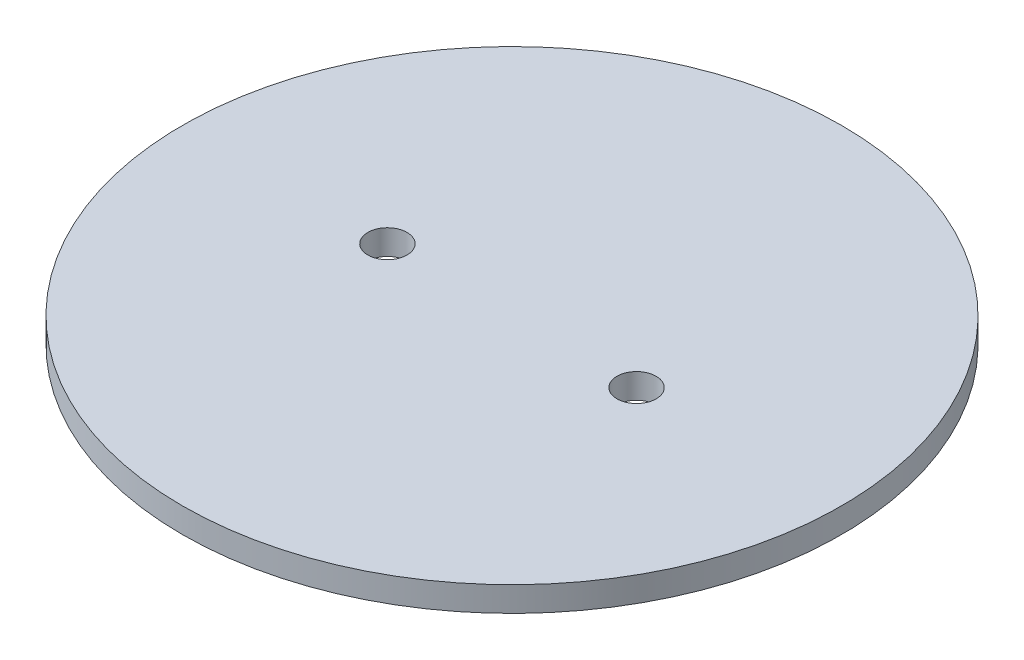
ISO-10303-21;
HEADER;
FILE_DESCRIPTION(('STEP AP214'),'2;1');
FILE_NAME('part.step','',(''),(''),'','','');
FILE_SCHEMA(('AUTOMOTIVE_DESIGN { 1 0 10303 214 1 1 1 1 }'));
ENDSEC;
DATA;
#1=APPLICATION_CONTEXT('core data for automotive mechanical design processes');
#2=APPLICATION_PROTOCOL_DEFINITION('international standard','automotive_design',2000,#1);
#3=PRODUCT_CONTEXT('',#1,'mechanical');
#4=PRODUCT('Part','Part','',(#3));
#5=PRODUCT_RELATED_PRODUCT_CATEGORY('part','',(#4));
#6=PRODUCT_DEFINITION_FORMATION('','',#4);
#7=PRODUCT_DEFINITION_CONTEXT('part definition',#1,'design');
#8=PRODUCT_DEFINITION('design','',#6,#7);
#9=PRODUCT_DEFINITION_SHAPE('','',#8);
#10=(LENGTH_UNIT() NAMED_UNIT(*) SI_UNIT(.MILLI.,.METRE.));
#11=(NAMED_UNIT(*) PLANE_ANGLE_UNIT() SI_UNIT($,.RADIAN.));
#12=(NAMED_UNIT(*) SI_UNIT($,.STERADIAN.) SOLID_ANGLE_UNIT());
#13=UNCERTAINTY_MEASURE_WITH_UNIT(LENGTH_MEASURE(1.E-05),#10,'distance_accuracy_value','');
#14=(GEOMETRIC_REPRESENTATION_CONTEXT(3) GLOBAL_UNCERTAINTY_ASSIGNED_CONTEXT((#13)) GLOBAL_UNIT_ASSIGNED_CONTEXT((#10,
#11,#12)) REPRESENTATION_CONTEXT('',''));
#15=CARTESIAN_POINT('',(0.,0.,0.));
#16=DIRECTION('',(0.,0.,1.));
#17=DIRECTION('',(1.,0.,0.));
#18=AXIS2_PLACEMENT_3D('',#15,#16,#17);
#19=CARTESIAN_POINT('',(33.6636824416529,2.54,33.6537385774837));
#20=DIRECTION('',(0.,1.,0.));
#21=DIRECTION('',(0.,0.,1.));
#22=AXIS2_PLACEMENT_3D('',#19,#20,#21);
#23=PLANE('',#22);
#24=CARTESIAN_POINT('',(46.373685990665,2.54,33.6537385774837));
#25=DIRECTION('',(0.,1.,0.));
#26=DIRECTION('',(0.,0.,-1.));
#27=AXIS2_PLACEMENT_3D('',#24,#25,#26);
#28=CIRCLE('',#27,2.);
#29=CARTESIAN_POINT('',(46.373685990665,2.54,31.6537385774837));
#30=VERTEX_POINT('',#29);
#31=EDGE_CURVE('E52',#30,#30,#28,.T.);
#32=ORIENTED_EDGE('',*,*,#31,.F.);
#33=EDGE_LOOP('',(#32));
#34=FACE_BOUND('',#33,.T.);
#35=CARTESIAN_POINT('',(33.6636824416529,2.54,33.6537385774837));
#36=DIRECTION('',(0.,1.,0.));
#37=DIRECTION('',(0.,0.,1.));
#38=AXIS2_PLACEMENT_3D('',#35,#36,#37);
#39=CIRCLE('',#38,33.6254391642506);
#40=CARTESIAN_POINT('',(33.6636824416529,2.54,67.2791777417343));
#41=VERTEX_POINT('',#40);
#42=EDGE_CURVE('E10',#41,#41,#39,.T.);
#43=ORIENTED_EDGE('',*,*,#42,.T.);
#44=EDGE_LOOP('',(#43));
#45=FACE_BOUND('',#44,.T.);
#46=CARTESIAN_POINT('',(20.9536788926407,2.54,33.6537385774837));
#47=DIRECTION('',(0.,1.,0.));
#48=DIRECTION('',(0.,0.,1.));
#49=AXIS2_PLACEMENT_3D('',#46,#47,#48);
#50=CIRCLE('',#49,2.);
#51=CARTESIAN_POINT('',(20.9536788926407,2.54,35.6537385774837));
#52=VERTEX_POINT('',#51);
#53=EDGE_CURVE('E57',#52,#52,#50,.T.);
#54=ORIENTED_EDGE('',*,*,#53,.F.);
#55=EDGE_LOOP('',(#54));
#56=FACE_BOUND('',#55,.T.);
#57=ADVANCED_FACE('F41',(#34,#45,#56),#23,.T.);
#58=CARTESIAN_POINT('',(33.6636824416529,0.,33.6537385774837));
#59=DIRECTION('',(0.,1.,0.));
#60=DIRECTION('',(0.,0.,1.));
#61=AXIS2_PLACEMENT_3D('',#58,#59,#60);
#62=PLANE('',#61);
#63=CARTESIAN_POINT('',(33.6636824416529,0.,33.6537385774837));
#64=DIRECTION('',(0.,1.,0.));
#65=DIRECTION('',(0.,0.,1.));
#66=AXIS2_PLACEMENT_3D('',#63,#64,#65);
#67=CIRCLE('',#66,33.6254391642506);
#68=CARTESIAN_POINT('',(33.6636824416529,0.,67.2791777417343));
#69=VERTEX_POINT('',#68);
#70=EDGE_CURVE('E45',#69,#69,#67,.T.);
#71=ORIENTED_EDGE('',*,*,#70,.F.);
#72=EDGE_LOOP('',(#71));
#73=FACE_BOUND('',#72,.T.);
#74=CARTESIAN_POINT('',(46.373685990665,0.,33.6537385774837));
#75=DIRECTION('',(0.,1.,0.));
#76=DIRECTION('',(0.,0.,-1.));
#77=AXIS2_PLACEMENT_3D('',#74,#75,#76);
#78=CIRCLE('',#77,2.);
#79=CARTESIAN_POINT('',(46.373685990665,0.,31.6537385774837));
#80=VERTEX_POINT('',#79);
#81=EDGE_CURVE('E54',#80,#80,#78,.T.);
#82=ORIENTED_EDGE('',*,*,#81,.T.);
#83=EDGE_LOOP('',(#82));
#84=FACE_BOUND('',#83,.T.);
#85=CARTESIAN_POINT('',(20.9536788926407,0.,33.6537385774837));
#86=DIRECTION('',(0.,1.,0.));
#87=DIRECTION('',(0.,0.,1.));
#88=AXIS2_PLACEMENT_3D('',#85,#86,#87);
#89=CIRCLE('',#88,2.);
#90=CARTESIAN_POINT('',(20.9536788926407,0.,35.6537385774837));
#91=VERTEX_POINT('',#90);
#92=EDGE_CURVE('E60',#91,#91,#89,.T.);
#93=ORIENTED_EDGE('',*,*,#92,.T.);
#94=EDGE_LOOP('',(#93));
#95=FACE_BOUND('',#94,.T.);
#96=ADVANCED_FACE('F70',(#73,#84,#95),#62,.F.);
#97=CARTESIAN_POINT('',(33.6636824416529,2.54,33.6537385774837));
#98=DIRECTION('',(0.,-1.,0.));
#99=DIRECTION('',(0.,0.,-1.));
#100=AXIS2_PLACEMENT_3D('',#97,#98,#99);
#101=CYLINDRICAL_SURFACE('',#100,33.6254391642506);
#102=ORIENTED_EDGE('',*,*,#42,.F.);
#103=EDGE_LOOP('',(#102));
#104=FACE_BOUND('',#103,.T.);
#105=ORIENTED_EDGE('',*,*,#70,.T.);
#106=EDGE_LOOP('',(#105));
#107=FACE_BOUND('',#106,.T.);
#108=ADVANCED_FACE('F43',(#104,#107),#101,.T.);
#109=CARTESIAN_POINT('',(46.373685990665,2.54,33.6537385774837));
#110=DIRECTION('',(0.,-1.,0.));
#111=DIRECTION('',(0.,0.,-1.));
#112=AXIS2_PLACEMENT_3D('',#109,#110,#111);
#113=CYLINDRICAL_SURFACE('',#112,2.);
#114=ORIENTED_EDGE('',*,*,#31,.T.);
#115=EDGE_LOOP('',(#114));
#116=FACE_BOUND('',#115,.T.);
#117=ORIENTED_EDGE('',*,*,#81,.F.);
#118=EDGE_LOOP('',(#117));
#119=FACE_BOUND('',#118,.T.);
#120=ADVANCED_FACE('F79',(#116,#119),#113,.F.);
#121=CARTESIAN_POINT('',(20.9536788926407,2.54,33.6537385774837));
#122=DIRECTION('',(0.,-1.,0.));
#123=DIRECTION('',(0.,0.,-1.));
#124=AXIS2_PLACEMENT_3D('',#121,#122,#123);
#125=CYLINDRICAL_SURFACE('',#124,2.);
#126=ORIENTED_EDGE('',*,*,#53,.T.);
#127=EDGE_LOOP('',(#126));
#128=FACE_BOUND('',#127,.T.);
#129=ORIENTED_EDGE('',*,*,#92,.F.);
#130=EDGE_LOOP('',(#129));
#131=FACE_BOUND('',#130,.T.);
#132=ADVANCED_FACE('F66',(#128,#131),#125,.F.);
#133=CLOSED_SHELL('',(#57,#96,#108,#120,#132));
#134=MANIFOLD_SOLID_BREP('B2',#133);
#135=ADVANCED_BREP_SHAPE_REPRESENTATION('',(#18,#134),#14);
#136=SHAPE_DEFINITION_REPRESENTATION(#9,#135);
ENDSEC;
END-ISO-10303-21;
